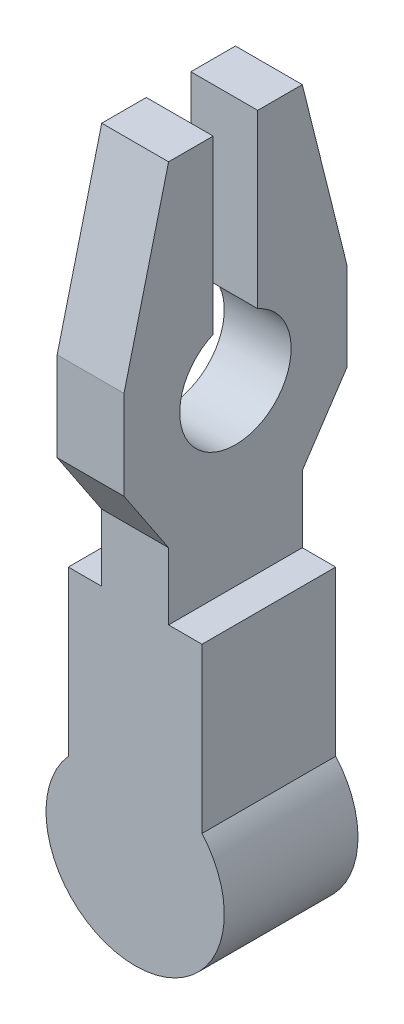
ISO-10303-21;
HEADER;
FILE_DESCRIPTION(('STEP AP214'),'2;1');
FILE_NAME('part.step','',(''),(''),'','','');
FILE_SCHEMA(('AUTOMOTIVE_DESIGN { 1 0 10303 214 1 1 1 1 }'));
ENDSEC;
DATA;
#1=APPLICATION_CONTEXT('core data for automotive mechanical design processes');
#2=APPLICATION_PROTOCOL_DEFINITION('international standard','automotive_design',2000,#1);
#3=PRODUCT_CONTEXT('',#1,'mechanical');
#4=PRODUCT('Part','Part','',(#3));
#5=PRODUCT_RELATED_PRODUCT_CATEGORY('part','',(#4));
#6=PRODUCT_DEFINITION_FORMATION('','',#4);
#7=PRODUCT_DEFINITION_CONTEXT('part definition',#1,'design');
#8=PRODUCT_DEFINITION('design','',#6,#7);
#9=PRODUCT_DEFINITION_SHAPE('','',#8);
#10=(LENGTH_UNIT() NAMED_UNIT(*) SI_UNIT(.MILLI.,.METRE.));
#11=(NAMED_UNIT(*) PLANE_ANGLE_UNIT() SI_UNIT($,.RADIAN.));
#12=(NAMED_UNIT(*) SI_UNIT($,.STERADIAN.) SOLID_ANGLE_UNIT());
#13=UNCERTAINTY_MEASURE_WITH_UNIT(LENGTH_MEASURE(1.E-05),#10,'distance_accuracy_value','');
#14=(GEOMETRIC_REPRESENTATION_CONTEXT(3) GLOBAL_UNCERTAINTY_ASSIGNED_CONTEXT((#13)) GLOBAL_UNIT_ASSIGNED_CONTEXT((#10,
#11,#12)) REPRESENTATION_CONTEXT('',''));
#15=CARTESIAN_POINT('',(0.,0.,0.));
#16=DIRECTION('',(0.,0.,1.));
#17=DIRECTION('',(1.,0.,0.));
#18=AXIS2_PLACEMENT_3D('',#15,#16,#17);
#19=CARTESIAN_POINT('',(-30.,100.,30.));
#20=DIRECTION('',(0.,-1.,0.));
#21=DIRECTION('',(0.,0.,-1.));
#22=AXIS2_PLACEMENT_3D('',#19,#20,#21);
#23=PLANE('',#22);
#24=DIRECTION('',(0.,0.,-1.));
#25=VECTOR('',#24,1.);
#26=CARTESIAN_POINT('',(15.,100.,-30.));
#27=LINE('',#26,#25);
#28=CARTESIAN_POINT('',(15.,100.,30.));
#29=VERTEX_POINT('',#28);
#30=CARTESIAN_POINT('',(15.,100.,-30.));
#31=VERTEX_POINT('',#30);
#32=EDGE_CURVE('E56',#29,#31,#27,.T.);
#33=ORIENTED_EDGE('',*,*,#32,.F.);
#34=DIRECTION('',(-1.,0.,0.));
#35=VECTOR('',#34,1.);
#36=CARTESIAN_POINT('',(-30.,100.,30.));
#37=LINE('',#36,#35);
#38=CARTESIAN_POINT('',(30.,100.,30.));
#39=VERTEX_POINT('',#38);
#40=EDGE_CURVE('E271',#39,#29,#37,.T.);
#41=ORIENTED_EDGE('',*,*,#40,.F.);
#42=DIRECTION('',(0.,0.,-1.));
#43=VECTOR('',#42,1.);
#44=CARTESIAN_POINT('',(30.,100.,30.));
#45=LINE('',#44,#43);
#46=CARTESIAN_POINT('',(30.,100.,-30.));
#47=VERTEX_POINT('',#46);
#48=EDGE_CURVE('E161',#39,#47,#45,.T.);
#49=ORIENTED_EDGE('',*,*,#48,.T.);
#50=DIRECTION('',(-1.,0.,0.));
#51=VECTOR('',#50,1.);
#52=CARTESIAN_POINT('',(-30.,100.,-30.));
#53=LINE('',#52,#51);
#54=EDGE_CURVE('E158',#47,#31,#53,.T.);
#55=ORIENTED_EDGE('',*,*,#54,.T.);
#56=EDGE_LOOP('',(#33,#41,#49,#55));
#57=FACE_BOUND('',#56,.T.);
#58=ADVANCED_FACE('F33',(#57),#23,.F.);
#59=CARTESIAN_POINT('',(0.,0.,30.));
#60=DIRECTION('',(0.,0.,-1.));
#61=DIRECTION('',(-1.,0.,0.));
#62=AXIS2_PLACEMENT_3D('',#59,#60,#61);
#63=CYLINDRICAL_SURFACE('',#62,40.);
#64=DIRECTION('',(0.,0.,-1.));
#65=VECTOR('',#64,1.);
#66=CARTESIAN_POINT('',(-30.,26.4575131106459,30.));
#67=LINE('',#66,#65);
#68=CARTESIAN_POINT('',(-30.,26.4575131106459,-30.));
#69=VERTEX_POINT('',#68);
#70=CARTESIAN_POINT('',(-30.,26.4575131106459,30.));
#71=VERTEX_POINT('',#70);
#72=EDGE_CURVE('E284',#69,#71,#67,.F.);
#73=ORIENTED_EDGE('',*,*,#72,.F.);
#74=CARTESIAN_POINT('',(0.,0.,-30.));
#75=DIRECTION('',(0.,0.,1.));
#76=DIRECTION('',(1.,0.,0.));
#77=AXIS2_PLACEMENT_3D('',#74,#75,#76);
#78=CIRCLE('',#77,40.);
#79=CARTESIAN_POINT('',(30.,26.4575131106459,-30.));
#80=VERTEX_POINT('',#79);
#81=EDGE_CURVE('E37',#69,#80,#78,.T.);
#82=ORIENTED_EDGE('',*,*,#81,.T.);
#83=DIRECTION('',(0.,0.,-1.));
#84=VECTOR('',#83,1.);
#85=CARTESIAN_POINT('',(30.,26.4575131106459,30.));
#86=LINE('',#85,#84);
#87=CARTESIAN_POINT('',(30.,26.4575131106459,30.));
#88=VERTEX_POINT('',#87);
#89=EDGE_CURVE('E281',#88,#80,#86,.T.);
#90=ORIENTED_EDGE('',*,*,#89,.F.);
#91=CARTESIAN_POINT('',(0.,0.,30.));
#92=DIRECTION('',(0.,0.,1.));
#93=DIRECTION('',(1.,0.,0.));
#94=AXIS2_PLACEMENT_3D('',#91,#92,#93);
#95=CIRCLE('',#94,40.);
#96=EDGE_CURVE('E11',#71,#88,#95,.T.);
#97=ORIENTED_EDGE('',*,*,#96,.F.);
#98=EDGE_LOOP('',(#73,#82,#90,#97));
#99=FACE_BOUND('',#98,.T.);
#100=ADVANCED_FACE('F35',(#99),#63,.T.);
#101=CARTESIAN_POINT('',(0.,0.,30.));
#102=DIRECTION('',(0.,0.,1.));
#103=DIRECTION('',(1.,0.,0.));
#104=AXIS2_PLACEMENT_3D('',#101,#102,#103);
#105=PLANE('',#104);
#106=ORIENTED_EDGE('',*,*,#96,.T.);
#107=DIRECTION('',(0.,1.,0.));
#108=VECTOR('',#107,1.);
#109=CARTESIAN_POINT('',(30.,0.,30.));
#110=LINE('',#109,#108);
#111=EDGE_CURVE('E269',#88,#39,#110,.T.);
#112=ORIENTED_EDGE('',*,*,#111,.T.);
#113=ORIENTED_EDGE('',*,*,#40,.T.);
#114=DIRECTION('',(0.,-1.,0.));
#115=VECTOR('',#114,1.);
#116=CARTESIAN_POINT('',(15.,130.,30.));
#117=LINE('',#116,#115);
#118=CARTESIAN_POINT('',(15.,130.,30.));
#119=VERTEX_POINT('',#118);
#120=EDGE_CURVE('E179',#119,#29,#117,.T.);
#121=ORIENTED_EDGE('',*,*,#120,.F.);
#122=DIRECTION('',(-1.,0.,0.));
#123=VECTOR('',#122,1.);
#124=CARTESIAN_POINT('',(15.,130.,30.));
#125=LINE('',#124,#123);
#126=CARTESIAN_POINT('',(-15.,130.,30.));
#127=VERTEX_POINT('',#126);
#128=EDGE_CURVE('E207',#119,#127,#125,.T.);
#129=ORIENTED_EDGE('',*,*,#128,.T.);
#130=DIRECTION('',(0.,-1.,0.));
#131=VECTOR('',#130,1.);
#132=CARTESIAN_POINT('',(-15.,130.,30.));
#133=LINE('',#132,#131);
#134=CARTESIAN_POINT('',(-15.,100.,30.));
#135=VERTEX_POINT('',#134);
#136=EDGE_CURVE('E180',#127,#135,#133,.T.);
#137=ORIENTED_EDGE('',*,*,#136,.T.);
#138=CARTESIAN_POINT('',(-30.,100.,30.));
#139=VERTEX_POINT('',#138);
#140=EDGE_CURVE('E48',#135,#139,#37,.T.);
#141=ORIENTED_EDGE('',*,*,#140,.T.);
#142=DIRECTION('',(0.,-1.,0.));
#143=VECTOR('',#142,1.);
#144=CARTESIAN_POINT('',(-30.,0.,30.));
#145=LINE('',#144,#143);
#146=EDGE_CURVE('E164',#139,#71,#145,.T.);
#147=ORIENTED_EDGE('',*,*,#146,.T.);
#148=EDGE_LOOP('',(#106,#112,#113,#121,#129,#137,#141,#147));
#149=FACE_BOUND('',#148,.T.);
#150=ADVANCED_FACE('F295',(#149),#105,.T.);
#151=CARTESIAN_POINT('',(0.,0.,-30.));
#152=DIRECTION('',(0.,0.,1.));
#153=DIRECTION('',(1.,0.,0.));
#154=AXIS2_PLACEMENT_3D('',#151,#152,#153);
#155=PLANE('',#154);
#156=ORIENTED_EDGE('',*,*,#81,.F.);
#157=DIRECTION('',(0.,-1.,0.));
#158=VECTOR('',#157,1.);
#159=CARTESIAN_POINT('',(-30.,0.,-30.));
#160=LINE('',#159,#158);
#161=CARTESIAN_POINT('',(-30.,100.,-30.));
#162=VERTEX_POINT('',#161);
#163=EDGE_CURVE('E266',#162,#69,#160,.T.);
#164=ORIENTED_EDGE('',*,*,#163,.F.);
#165=CARTESIAN_POINT('',(-15.,100.,-30.));
#166=VERTEX_POINT('',#165);
#167=EDGE_CURVE('E165',#166,#162,#53,.T.);
#168=ORIENTED_EDGE('',*,*,#167,.F.);
#169=DIRECTION('',(0.,1.,0.));
#170=VECTOR('',#169,1.);
#171=CARTESIAN_POINT('',(-15.,130.,-30.));
#172=LINE('',#171,#170);
#173=CARTESIAN_POINT('',(-15.,130.,-30.));
#174=VERTEX_POINT('',#173);
#175=EDGE_CURVE('E210',#166,#174,#172,.T.);
#176=ORIENTED_EDGE('',*,*,#175,.T.);
#177=DIRECTION('',(-1.,0.,0.));
#178=VECTOR('',#177,1.);
#179=CARTESIAN_POINT('',(15.,130.,-30.));
#180=LINE('',#179,#178);
#181=CARTESIAN_POINT('',(15.,130.,-30.));
#182=VERTEX_POINT('',#181);
#183=EDGE_CURVE('E171',#182,#174,#180,.T.);
#184=ORIENTED_EDGE('',*,*,#183,.F.);
#185=DIRECTION('',(0.,1.,0.));
#186=VECTOR('',#185,1.);
#187=CARTESIAN_POINT('',(15.,130.,-30.));
#188=LINE('',#187,#186);
#189=EDGE_CURVE('E168',#31,#182,#188,.T.);
#190=ORIENTED_EDGE('',*,*,#189,.F.);
#191=ORIENTED_EDGE('',*,*,#54,.F.);
#192=DIRECTION('',(0.,1.,0.));
#193=VECTOR('',#192,1.);
#194=CARTESIAN_POINT('',(30.,0.,-30.));
#195=LINE('',#194,#193);
#196=EDGE_CURVE('E276',#80,#47,#195,.T.);
#197=ORIENTED_EDGE('',*,*,#196,.F.);
#198=EDGE_LOOP('',(#156,#164,#168,#176,#184,#190,#191,#197));
#199=FACE_BOUND('',#198,.T.);
#200=ADVANCED_FACE('F169',(#199),#155,.F.);
#201=CARTESIAN_POINT('',(-30.,0.,30.));
#202=DIRECTION('',(1.,0.,0.));
#203=DIRECTION('',(0.,0.,-1.));
#204=AXIS2_PLACEMENT_3D('',#201,#202,#203);
#205=PLANE('',#204);
#206=ORIENTED_EDGE('',*,*,#163,.T.);
#207=ORIENTED_EDGE('',*,*,#72,.T.);
#208=ORIENTED_EDGE('',*,*,#146,.F.);
#209=DIRECTION('',(0.,0.,-1.));
#210=VECTOR('',#209,1.);
#211=CARTESIAN_POINT('',(-30.,100.,30.));
#212=LINE('',#211,#210);
#213=EDGE_CURVE('E273',#139,#162,#212,.T.);
#214=ORIENTED_EDGE('',*,*,#213,.T.);
#215=EDGE_LOOP('',(#206,#207,#208,#214));
#216=FACE_BOUND('',#215,.T.);
#217=ADVANCED_FACE('F296',(#216),#205,.F.);
#218=CARTESIAN_POINT('',(30.,0.,30.));
#219=DIRECTION('',(-1.,0.,0.));
#220=DIRECTION('',(0.,0.,1.));
#221=AXIS2_PLACEMENT_3D('',#218,#219,#220);
#222=PLANE('',#221);
#223=ORIENTED_EDGE('',*,*,#111,.F.);
#224=ORIENTED_EDGE('',*,*,#89,.T.);
#225=ORIENTED_EDGE('',*,*,#196,.T.);
#226=ORIENTED_EDGE('',*,*,#48,.F.);
#227=EDGE_LOOP('',(#223,#224,#225,#226));
#228=FACE_BOUND('',#227,.T.);
#229=ADVANCED_FACE('F293',(#228),#222,.F.);
#230=ORIENTED_EDGE('',*,*,#140,.F.);
#231=DIRECTION('',(0.,0.,-1.));
#232=VECTOR('',#231,1.);
#233=CARTESIAN_POINT('',(-15.,100.,-30.));
#234=LINE('',#233,#232);
#235=EDGE_CURVE('E208',#135,#166,#234,.T.);
#236=ORIENTED_EDGE('',*,*,#235,.T.);
#237=ORIENTED_EDGE('',*,*,#167,.T.);
#238=ORIENTED_EDGE('',*,*,#213,.F.);
#239=EDGE_LOOP('',(#230,#236,#237,#238));
#240=FACE_BOUND('',#239,.T.);
#241=ADVANCED_FACE('F368',(#240),#23,.F.);
#242=CARTESIAN_POINT('',(15.,160.,-50.));
#243=DIRECTION('',(0.,0.554700196225229,0.832050294337843));
#244=DIRECTION('',(0.,-0.832050294337843,0.554700196225229));
#245=AXIS2_PLACEMENT_3D('',#242,#243,#244);
#246=PLANE('',#245);
#247=DIRECTION('',(0.,0.832050294337843,-0.554700196225229));
#248=VECTOR('',#247,1.);
#249=CARTESIAN_POINT('',(-15.,160.,-50.));
#250=LINE('',#249,#248);
#251=CARTESIAN_POINT('',(-15.,160.,-50.));
#252=VERTEX_POINT('',#251);
#253=EDGE_CURVE('E212',#174,#252,#250,.T.);
#254=ORIENTED_EDGE('',*,*,#253,.T.);
#255=DIRECTION('',(-1.,0.,0.));
#256=VECTOR('',#255,1.);
#257=CARTESIAN_POINT('',(15.,160.,-50.));
#258=LINE('',#257,#256);
#259=CARTESIAN_POINT('',(15.,160.,-50.));
#260=VERTEX_POINT('',#259);
#261=EDGE_CURVE('E262',#260,#252,#258,.T.);
#262=ORIENTED_EDGE('',*,*,#261,.F.);
#263=DIRECTION('',(0.,0.832050294337843,-0.554700196225229));
#264=VECTOR('',#263,1.);
#265=CARTESIAN_POINT('',(15.,160.,-50.));
#266=LINE('',#265,#264);
#267=EDGE_CURVE('E174',#182,#260,#266,.T.);
#268=ORIENTED_EDGE('',*,*,#267,.F.);
#269=ORIENTED_EDGE('',*,*,#183,.T.);
#270=EDGE_LOOP('',(#254,#262,#268,#269));
#271=FACE_BOUND('',#270,.T.);
#272=ADVANCED_FACE('F308',(#271),#246,.F.);
#273=CARTESIAN_POINT('',(15.,200.,-50.));
#274=DIRECTION('',(0.,0.,1.));
#275=DIRECTION('',(0.,-1.,0.));
#276=AXIS2_PLACEMENT_3D('',#273,#274,#275);
#277=PLANE('',#276);
#278=DIRECTION('',(0.,1.,0.));
#279=VECTOR('',#278,1.);
#280=CARTESIAN_POINT('',(-15.,200.,-50.));
#281=LINE('',#280,#279);
#282=CARTESIAN_POINT('',(-15.,200.,-50.));
#283=VERTEX_POINT('',#282);
#284=EDGE_CURVE('E214',#252,#283,#281,.T.);
#285=ORIENTED_EDGE('',*,*,#284,.T.);
#286=DIRECTION('',(-1.,0.,0.));
#287=VECTOR('',#286,1.);
#288=CARTESIAN_POINT('',(15.,200.,-50.));
#289=LINE('',#288,#287);
#290=CARTESIAN_POINT('',(15.,200.,-50.));
#291=VERTEX_POINT('',#290);
#292=EDGE_CURVE('E259',#291,#283,#289,.T.);
#293=ORIENTED_EDGE('',*,*,#292,.F.);
#294=DIRECTION('',(0.,1.,0.));
#295=VECTOR('',#294,1.);
#296=CARTESIAN_POINT('',(15.,200.,-50.));
#297=LINE('',#296,#295);
#298=EDGE_CURVE('E186',#260,#291,#297,.T.);
#299=ORIENTED_EDGE('',*,*,#298,.F.);
#300=ORIENTED_EDGE('',*,*,#261,.T.);
#301=EDGE_LOOP('',(#285,#293,#299,#300));
#302=FACE_BOUND('',#301,.T.);
#303=ADVANCED_FACE('F311',(#302),#277,.F.);
#304=CARTESIAN_POINT('',(15.,280.,-30.));
#305=DIRECTION('',(0.,-0.242535625036333,0.970142500145332));
#306=DIRECTION('',(0.,-0.970142500145332,-0.242535625036333));
#307=AXIS2_PLACEMENT_3D('',#304,#305,#306);
#308=PLANE('',#307);
#309=DIRECTION('',(0.,0.970142500145332,0.242535625036333));
#310=VECTOR('',#309,1.);
#311=CARTESIAN_POINT('',(-15.,280.,-30.));
#312=LINE('',#311,#310);
#313=CARTESIAN_POINT('',(-15.,280.,-30.));
#314=VERTEX_POINT('',#313);
#315=EDGE_CURVE('E216',#283,#314,#312,.T.);
#316=ORIENTED_EDGE('',*,*,#315,.T.);
#317=DIRECTION('',(-1.,0.,0.));
#318=VECTOR('',#317,1.);
#319=CARTESIAN_POINT('',(15.,280.,-30.));
#320=LINE('',#319,#318);
#321=CARTESIAN_POINT('',(15.,280.,-30.));
#322=VERTEX_POINT('',#321);
#323=EDGE_CURVE('E256',#322,#314,#320,.T.);
#324=ORIENTED_EDGE('',*,*,#323,.F.);
#325=DIRECTION('',(0.,0.970142500145332,0.242535625036333));
#326=VECTOR('',#325,1.);
#327=CARTESIAN_POINT('',(15.,280.,-30.));
#328=LINE('',#327,#326);
#329=EDGE_CURVE('E188',#291,#322,#328,.T.);
#330=ORIENTED_EDGE('',*,*,#329,.F.);
#331=ORIENTED_EDGE('',*,*,#292,.T.);
#332=EDGE_LOOP('',(#316,#324,#330,#331));
#333=FACE_BOUND('',#332,.T.);
#334=ADVANCED_FACE('F318',(#333),#308,.F.);
#335=CARTESIAN_POINT('',(15.,280.,-10.));
#336=DIRECTION('',(0.,-1.,0.));
#337=DIRECTION('',(0.,0.,-1.));
#338=AXIS2_PLACEMENT_3D('',#335,#336,#337);
#339=PLANE('',#338);
#340=DIRECTION('',(0.,0.,1.));
#341=VECTOR('',#340,1.);
#342=CARTESIAN_POINT('',(-15.,280.,-10.));
#343=LINE('',#342,#341);
#344=CARTESIAN_POINT('',(-15.,280.,-10.));
#345=VERTEX_POINT('',#344);
#346=EDGE_CURVE('E218',#314,#345,#343,.T.);
#347=ORIENTED_EDGE('',*,*,#346,.T.);
#348=DIRECTION('',(-1.,0.,0.));
#349=VECTOR('',#348,1.);
#350=CARTESIAN_POINT('',(15.,280.,-10.));
#351=LINE('',#350,#349);
#352=CARTESIAN_POINT('',(15.,280.,-10.));
#353=VERTEX_POINT('',#352);
#354=EDGE_CURVE('E253',#353,#345,#351,.T.);
#355=ORIENTED_EDGE('',*,*,#354,.F.);
#356=DIRECTION('',(0.,0.,1.));
#357=VECTOR('',#356,1.);
#358=CARTESIAN_POINT('',(15.,280.,-10.));
#359=LINE('',#358,#357);
#360=EDGE_CURVE('E190',#322,#353,#359,.T.);
#361=ORIENTED_EDGE('',*,*,#360,.F.);
#362=ORIENTED_EDGE('',*,*,#323,.T.);
#363=EDGE_LOOP('',(#347,#355,#361,#362));
#364=FACE_BOUND('',#363,.T.);
#365=ADVANCED_FACE('F321',(#364),#339,.F.);
#366=CARTESIAN_POINT('',(15.,202.912878474779,-10.));
#367=DIRECTION('',(0.,0.,-1.));
#368=DIRECTION('',(0.,1.,0.));
#369=AXIS2_PLACEMENT_3D('',#366,#367,#368);
#370=PLANE('',#369);
#371=DIRECTION('',(0.,-1.,0.));
#372=VECTOR('',#371,1.);
#373=CARTESIAN_POINT('',(-15.,202.912878474779,-10.));
#374=LINE('',#373,#372);
#375=CARTESIAN_POINT('',(-15.,202.912878474779,-10.));
#376=VERTEX_POINT('',#375);
#377=EDGE_CURVE('E220',#345,#376,#374,.T.);
#378=ORIENTED_EDGE('',*,*,#377,.T.);
#379=DIRECTION('',(-1.,0.,0.));
#380=VECTOR('',#379,1.);
#381=CARTESIAN_POINT('',(15.,202.912878474779,-10.));
#382=LINE('',#381,#380);
#383=CARTESIAN_POINT('',(15.,202.912878474779,-10.));
#384=VERTEX_POINT('',#383);
#385=EDGE_CURVE('E250',#384,#376,#382,.T.);
#386=ORIENTED_EDGE('',*,*,#385,.F.);
#387=DIRECTION('',(0.,-1.,0.));
#388=VECTOR('',#387,1.);
#389=CARTESIAN_POINT('',(15.,202.912878474779,-10.));
#390=LINE('',#389,#388);
#391=EDGE_CURVE('E192',#353,#384,#390,.T.);
#392=ORIENTED_EDGE('',*,*,#391,.F.);
#393=ORIENTED_EDGE('',*,*,#354,.T.);
#394=EDGE_LOOP('',(#378,#386,#392,#393));
#395=FACE_BOUND('',#394,.T.);
#396=ADVANCED_FACE('F326',(#395),#370,.F.);
#397=CARTESIAN_POINT('',(15.,180.,0.));
#398=DIRECTION('',(-1.,0.,0.));
#399=DIRECTION('',(0.,0.,1.));
#400=AXIS2_PLACEMENT_3D('',#397,#398,#399);
#401=CYLINDRICAL_SURFACE('',#400,25.);
#402=CARTESIAN_POINT('',(-15.,180.,0.));
#403=DIRECTION('',(-1.,0.,0.));
#404=DIRECTION('',(0.,0.,-1.));
#405=AXIS2_PLACEMENT_3D('',#402,#403,#404);
#406=CIRCLE('',#405,25.);
#407=CARTESIAN_POINT('',(-15.,202.912878474779,10.));
#408=VERTEX_POINT('',#407);
#409=EDGE_CURVE('E222',#376,#408,#406,.T.);
#410=ORIENTED_EDGE('',*,*,#409,.T.);
#411=DIRECTION('',(-1.,0.,0.));
#412=VECTOR('',#411,1.);
#413=CARTESIAN_POINT('',(15.,202.912878474779,10.));
#414=LINE('',#413,#412);
#415=CARTESIAN_POINT('',(15.,202.912878474779,10.));
#416=VERTEX_POINT('',#415);
#417=EDGE_CURVE('E247',#416,#408,#414,.T.);
#418=ORIENTED_EDGE('',*,*,#417,.F.);
#419=CARTESIAN_POINT('',(15.,180.,0.));
#420=DIRECTION('',(-1.,0.,0.));
#421=DIRECTION('',(0.,0.,-1.));
#422=AXIS2_PLACEMENT_3D('',#419,#420,#421);
#423=CIRCLE('',#422,25.);
#424=EDGE_CURVE('E194',#384,#416,#423,.T.);
#425=ORIENTED_EDGE('',*,*,#424,.F.);
#426=ORIENTED_EDGE('',*,*,#385,.T.);
#427=EDGE_LOOP('',(#410,#418,#425,#426));
#428=FACE_BOUND('',#427,.T.);
#429=ADVANCED_FACE('F332',(#428),#401,.F.);
#430=CARTESIAN_POINT('',(15.,202.912878474779,10.));
#431=DIRECTION('',(0.,0.,1.));
#432=DIRECTION('',(0.,-1.,0.));
#433=AXIS2_PLACEMENT_3D('',#430,#431,#432);
#434=PLANE('',#433);
#435=DIRECTION('',(0.,1.,0.));
#436=VECTOR('',#435,1.);
#437=CARTESIAN_POINT('',(-15.,202.912878474779,10.));
#438=LINE('',#437,#436);
#439=CARTESIAN_POINT('',(-15.,280.,10.));
#440=VERTEX_POINT('',#439);
#441=EDGE_CURVE('E224',#408,#440,#438,.T.);
#442=ORIENTED_EDGE('',*,*,#441,.T.);
#443=DIRECTION('',(-1.,0.,0.));
#444=VECTOR('',#443,1.);
#445=CARTESIAN_POINT('',(15.,280.,10.));
#446=LINE('',#445,#444);
#447=CARTESIAN_POINT('',(15.,280.,10.));
#448=VERTEX_POINT('',#447);
#449=EDGE_CURVE('E244',#448,#440,#446,.T.);
#450=ORIENTED_EDGE('',*,*,#449,.F.);
#451=DIRECTION('',(0.,1.,0.));
#452=VECTOR('',#451,1.);
#453=CARTESIAN_POINT('',(15.,202.912878474779,10.));
#454=LINE('',#453,#452);
#455=EDGE_CURVE('E196',#416,#448,#454,.T.);
#456=ORIENTED_EDGE('',*,*,#455,.F.);
#457=ORIENTED_EDGE('',*,*,#417,.T.);
#458=EDGE_LOOP('',(#442,#450,#456,#457));
#459=FACE_BOUND('',#458,.T.);
#460=ADVANCED_FACE('F336',(#459),#434,.F.);
#461=CARTESIAN_POINT('',(15.,280.,10.));
#462=DIRECTION('',(0.,-1.,0.));
#463=DIRECTION('',(0.,0.,-1.));
#464=AXIS2_PLACEMENT_3D('',#461,#462,#463);
#465=PLANE('',#464);
#466=DIRECTION('',(0.,0.,1.));
#467=VECTOR('',#466,1.);
#468=CARTESIAN_POINT('',(-15.,280.,10.));
#469=LINE('',#468,#467);
#470=CARTESIAN_POINT('',(-15.,280.,30.));
#471=VERTEX_POINT('',#470);
#472=EDGE_CURVE('E226',#440,#471,#469,.T.);
#473=ORIENTED_EDGE('',*,*,#472,.T.);
#474=DIRECTION('',(-1.,0.,0.));
#475=VECTOR('',#474,1.);
#476=CARTESIAN_POINT('',(15.,280.,30.));
#477=LINE('',#476,#475);
#478=CARTESIAN_POINT('',(15.,280.,30.));
#479=VERTEX_POINT('',#478);
#480=EDGE_CURVE('E241',#479,#471,#477,.T.);
#481=ORIENTED_EDGE('',*,*,#480,.F.);
#482=DIRECTION('',(0.,0.,1.));
#483=VECTOR('',#482,1.);
#484=CARTESIAN_POINT('',(15.,280.,10.));
#485=LINE('',#484,#483);
#486=EDGE_CURVE('E198',#448,#479,#485,.T.);
#487=ORIENTED_EDGE('',*,*,#486,.F.);
#488=ORIENTED_EDGE('',*,*,#449,.T.);
#489=EDGE_LOOP('',(#473,#481,#487,#488));
#490=FACE_BOUND('',#489,.T.);
#491=ADVANCED_FACE('F341',(#490),#465,.F.);
#492=CARTESIAN_POINT('',(15.,280.,30.));
#493=DIRECTION('',(0.,-0.242535625036333,-0.970142500145332));
#494=DIRECTION('',(0.,0.970142500145332,-0.242535625036333));
#495=AXIS2_PLACEMENT_3D('',#492,#493,#494);
#496=PLANE('',#495);
#497=DIRECTION('',(0.,-0.970142500145332,0.242535625036333));
#498=VECTOR('',#497,1.);
#499=CARTESIAN_POINT('',(-15.,280.,30.));
#500=LINE('',#499,#498);
#501=CARTESIAN_POINT('',(-15.,200.,50.));
#502=VERTEX_POINT('',#501);
#503=EDGE_CURVE('E228',#471,#502,#500,.T.);
#504=ORIENTED_EDGE('',*,*,#503,.T.);
#505=DIRECTION('',(-1.,0.,0.));
#506=VECTOR('',#505,1.);
#507=CARTESIAN_POINT('',(15.,200.,50.));
#508=LINE('',#507,#506);
#509=CARTESIAN_POINT('',(15.,200.,50.));
#510=VERTEX_POINT('',#509);
#511=EDGE_CURVE('E238',#510,#502,#508,.T.);
#512=ORIENTED_EDGE('',*,*,#511,.F.);
#513=DIRECTION('',(0.,-0.970142500145332,0.242535625036333));
#514=VECTOR('',#513,1.);
#515=CARTESIAN_POINT('',(15.,280.,30.));
#516=LINE('',#515,#514);
#517=EDGE_CURVE('E200',#479,#510,#516,.T.);
#518=ORIENTED_EDGE('',*,*,#517,.F.);
#519=ORIENTED_EDGE('',*,*,#480,.T.);
#520=EDGE_LOOP('',(#504,#512,#518,#519));
#521=FACE_BOUND('',#520,.T.);
#522=ADVANCED_FACE('F347',(#521),#496,.F.);
#523=CARTESIAN_POINT('',(15.,200.,50.));
#524=DIRECTION('',(0.,0.,-1.));
#525=DIRECTION('',(0.,1.,0.));
#526=AXIS2_PLACEMENT_3D('',#523,#524,#525);
#527=PLANE('',#526);
#528=DIRECTION('',(0.,-1.,0.));
#529=VECTOR('',#528,1.);
#530=CARTESIAN_POINT('',(-15.,200.,50.));
#531=LINE('',#530,#529);
#532=CARTESIAN_POINT('',(-15.,160.,50.));
#533=VERTEX_POINT('',#532);
#534=EDGE_CURVE('E230',#502,#533,#531,.T.);
#535=ORIENTED_EDGE('',*,*,#534,.T.);
#536=DIRECTION('',(-1.,0.,0.));
#537=VECTOR('',#536,1.);
#538=CARTESIAN_POINT('',(15.,160.,50.));
#539=LINE('',#538,#537);
#540=CARTESIAN_POINT('',(15.,160.,50.));
#541=VERTEX_POINT('',#540);
#542=EDGE_CURVE('E235',#541,#533,#539,.T.);
#543=ORIENTED_EDGE('',*,*,#542,.F.);
#544=DIRECTION('',(0.,-1.,0.));
#545=VECTOR('',#544,1.);
#546=CARTESIAN_POINT('',(15.,200.,50.));
#547=LINE('',#546,#545);
#548=EDGE_CURVE('E202',#510,#541,#547,.T.);
#549=ORIENTED_EDGE('',*,*,#548,.F.);
#550=ORIENTED_EDGE('',*,*,#511,.T.);
#551=EDGE_LOOP('',(#535,#543,#549,#550));
#552=FACE_BOUND('',#551,.T.);
#553=ADVANCED_FACE('F351',(#552),#527,.F.);
#554=CARTESIAN_POINT('',(15.,160.,50.));
#555=DIRECTION('',(0.,0.554700196225229,-0.832050294337843));
#556=DIRECTION('',(0.,0.832050294337843,0.554700196225229));
#557=AXIS2_PLACEMENT_3D('',#554,#555,#556);
#558=PLANE('',#557);
#559=DIRECTION('',(0.,-0.832050294337843,-0.554700196225229));
#560=VECTOR('',#559,1.);
#561=CARTESIAN_POINT('',(-15.,160.,50.));
#562=LINE('',#561,#560);
#563=EDGE_CURVE('E182',#533,#127,#562,.T.);
#564=ORIENTED_EDGE('',*,*,#563,.T.);
#565=ORIENTED_EDGE('',*,*,#128,.F.);
#566=DIRECTION('',(0.,-0.832050294337843,-0.554700196225229));
#567=VECTOR('',#566,1.);
#568=CARTESIAN_POINT('',(15.,160.,50.));
#569=LINE('',#568,#567);
#570=EDGE_CURVE('E204',#541,#119,#569,.T.);
#571=ORIENTED_EDGE('',*,*,#570,.F.);
#572=ORIENTED_EDGE('',*,*,#542,.T.);
#573=EDGE_LOOP('',(#564,#565,#571,#572));
#574=FACE_BOUND('',#573,.T.);
#575=ADVANCED_FACE('F356',(#574),#558,.F.);
#576=CARTESIAN_POINT('',(15.,180.,0.));
#577=DIRECTION('',(1.,0.,0.));
#578=DIRECTION('',(0.,0.,-1.));
#579=AXIS2_PLACEMENT_3D('',#576,#577,#578);
#580=PLANE('',#579);
#581=ORIENTED_EDGE('',*,*,#32,.T.);
#582=ORIENTED_EDGE('',*,*,#189,.T.);
#583=ORIENTED_EDGE('',*,*,#267,.T.);
#584=ORIENTED_EDGE('',*,*,#298,.T.);
#585=ORIENTED_EDGE('',*,*,#329,.T.);
#586=ORIENTED_EDGE('',*,*,#360,.T.);
#587=ORIENTED_EDGE('',*,*,#391,.T.);
#588=ORIENTED_EDGE('',*,*,#424,.T.);
#589=ORIENTED_EDGE('',*,*,#455,.T.);
#590=ORIENTED_EDGE('',*,*,#486,.T.);
#591=ORIENTED_EDGE('',*,*,#517,.T.);
#592=ORIENTED_EDGE('',*,*,#548,.T.);
#593=ORIENTED_EDGE('',*,*,#570,.T.);
#594=ORIENTED_EDGE('',*,*,#120,.T.);
#595=EDGE_LOOP('',(#581,#582,#583,#584,#585,#586,#587,#588,#589,#590,#591,#592,#593,#594));
#596=FACE_BOUND('',#595,.T.);
#597=ADVANCED_FACE('F177',(#596),#580,.T.);
#598=CARTESIAN_POINT('',(-15.,180.,0.));
#599=DIRECTION('',(1.,0.,0.));
#600=DIRECTION('',(0.,0.,-1.));
#601=AXIS2_PLACEMENT_3D('',#598,#599,#600);
#602=PLANE('',#601);
#603=ORIENTED_EDGE('',*,*,#235,.F.);
#604=ORIENTED_EDGE('',*,*,#136,.F.);
#605=ORIENTED_EDGE('',*,*,#563,.F.);
#606=ORIENTED_EDGE('',*,*,#534,.F.);
#607=ORIENTED_EDGE('',*,*,#503,.F.);
#608=ORIENTED_EDGE('',*,*,#472,.F.);
#609=ORIENTED_EDGE('',*,*,#441,.F.);
#610=ORIENTED_EDGE('',*,*,#409,.F.);
#611=ORIENTED_EDGE('',*,*,#377,.F.);
#612=ORIENTED_EDGE('',*,*,#346,.F.);
#613=ORIENTED_EDGE('',*,*,#315,.F.);
#614=ORIENTED_EDGE('',*,*,#284,.F.);
#615=ORIENTED_EDGE('',*,*,#253,.F.);
#616=ORIENTED_EDGE('',*,*,#175,.F.);
#617=EDGE_LOOP('',(#603,#604,#605,#606,#607,#608,#609,#610,#611,#612,#613,#614,#615,#616));
#618=FACE_BOUND('',#617,.T.);
#619=ADVANCED_FACE('F302',(#618),#602,.F.);
#620=CLOSED_SHELL('',(#58,#100,#150,#200,#217,#229,#241,#272,#303,#334,#365,#396,#429,#460,#491,
#522,#553,#575,#597,#619));
#621=MANIFOLD_SOLID_BREP('B2',#620);
#622=ADVANCED_BREP_SHAPE_REPRESENTATION('',(#18,#621),#14);
#623=SHAPE_DEFINITION_REPRESENTATION(#9,#622);
ENDSEC;
END-ISO-10303-21;
